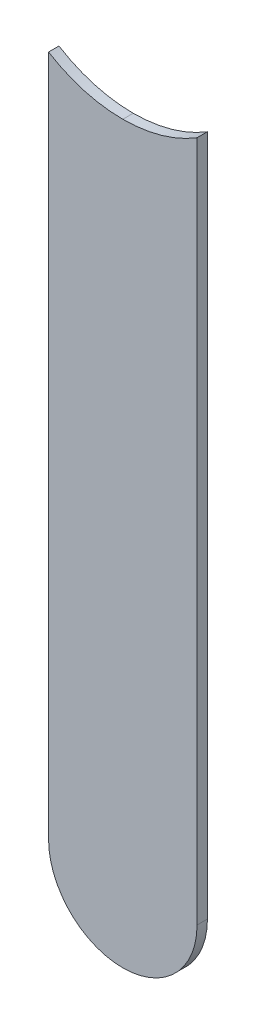
ISO-10303-21;
HEADER;
FILE_DESCRIPTION(('STEP AP214'),'2;1');
FILE_NAME('part.step','',(''),(''),'','','');
FILE_SCHEMA(('AUTOMOTIVE_DESIGN { 1 0 10303 214 1 1 1 1 }'));
ENDSEC;
DATA;
#1=APPLICATION_CONTEXT('core data for automotive mechanical design processes');
#2=APPLICATION_PROTOCOL_DEFINITION('international standard','automotive_design',2000,#1);
#3=PRODUCT_CONTEXT('',#1,'mechanical');
#4=PRODUCT('Part','Part','',(#3));
#5=PRODUCT_RELATED_PRODUCT_CATEGORY('part','',(#4));
#6=PRODUCT_DEFINITION_FORMATION('','',#4);
#7=PRODUCT_DEFINITION_CONTEXT('part definition',#1,'design');
#8=PRODUCT_DEFINITION('design','',#6,#7);
#9=PRODUCT_DEFINITION_SHAPE('','',#8);
#10=(LENGTH_UNIT() NAMED_UNIT(*) SI_UNIT(.MILLI.,.METRE.));
#11=(NAMED_UNIT(*) PLANE_ANGLE_UNIT() SI_UNIT($,.RADIAN.));
#12=(NAMED_UNIT(*) SI_UNIT($,.STERADIAN.) SOLID_ANGLE_UNIT());
#13=UNCERTAINTY_MEASURE_WITH_UNIT(LENGTH_MEASURE(1.E-05),#10,'distance_accuracy_value','');
#14=(GEOMETRIC_REPRESENTATION_CONTEXT(3) GLOBAL_UNCERTAINTY_ASSIGNED_CONTEXT((#13)) GLOBAL_UNIT_ASSIGNED_CONTEXT((#10,
#11,#12)) REPRESENTATION_CONTEXT('',''));
#15=CARTESIAN_POINT('',(0.,0.,0.));
#16=DIRECTION('',(0.,0.,1.));
#17=DIRECTION('',(1.,0.,0.));
#18=AXIS2_PLACEMENT_3D('',#15,#16,#17);
#19=CARTESIAN_POINT('',(154.87,-49.98,-0.045));
#20=DIRECTION('',(0.,0.,-1.));
#21=DIRECTION('',(0.,-1.,0.));
#22=AXIS2_PLACEMENT_3D('',#19,#20,#21);
#23=CYLINDRICAL_SURFACE('',#22,0.475);
#24=DIRECTION('',(0.,0.,1.));
#25=VECTOR('',#24,1.);
#26=CARTESIAN_POINT('',(154.87,-50.455,-0.045));
#27=LINE('',#26,#25);
#28=CARTESIAN_POINT('',(154.87,-50.455,1.6));
#29=VERTEX_POINT('',#28);
#30=CARTESIAN_POINT('',(154.87,-50.455,1.635));
#31=VERTEX_POINT('',#30);
#32=EDGE_CURVE('E66',#29,#31,#27,.T.);
#33=ORIENTED_EDGE('',*,*,#32,.F.);
#34=CARTESIAN_POINT('',(154.87,-49.98,1.6));
#35=DIRECTION('',(0.,0.,-1.));
#36=DIRECTION('',(0.,-1.,0.));
#37=AXIS2_PLACEMENT_3D('',#34,#35,#36);
#38=CIRCLE('',#37,0.475);
#39=CARTESIAN_POINT('',(154.62,-50.38388736053,1.6));
#40=VERTEX_POINT('',#39);
#41=EDGE_CURVE('E69',#29,#40,#38,.T.);
#42=ORIENTED_EDGE('',*,*,#41,.T.);
#43=DIRECTION('',(0.,0.,-1.));
#44=VECTOR('',#43,1.);
#45=CARTESIAN_POINT('',(154.62,-50.38388736053,-0.045));
#46=LINE('',#45,#44);
#47=CARTESIAN_POINT('',(154.62,-50.38388736053,1.635));
#48=VERTEX_POINT('',#47);
#49=EDGE_CURVE('E11',#48,#40,#46,.T.);
#50=ORIENTED_EDGE('',*,*,#49,.F.);
#51=CARTESIAN_POINT('',(154.87,-49.98,1.635));
#52=DIRECTION('',(0.,0.,-1.));
#53=DIRECTION('',(0.,-1.,0.));
#54=AXIS2_PLACEMENT_3D('',#51,#52,#53);
#55=CIRCLE('',#54,0.475);
#56=EDGE_CURVE('E72',#31,#48,#55,.T.);
#57=ORIENTED_EDGE('',*,*,#56,.F.);
#58=EDGE_LOOP('',(#33,#42,#50,#57));
#59=FACE_BOUND('',#58,.T.);
#60=ADVANCED_FACE('F17',(#59),#23,.F.);
#61=CARTESIAN_POINT('',(154.62,-49.98,1.6));
#62=DIRECTION('',(1.,0.,0.));
#63=DIRECTION('',(0.,1.,0.));
#64=AXIS2_PLACEMENT_3D('',#61,#62,#63);
#65=PLANE('',#64);
#66=DIRECTION('',(0.,0.,1.));
#67=VECTOR('',#66,1.);
#68=CARTESIAN_POINT('',(154.62,-52.68,1.6));
#69=LINE('',#68,#67);
#70=CARTESIAN_POINT('',(154.62,-52.68,1.6));
#71=VERTEX_POINT('',#70);
#72=CARTESIAN_POINT('',(154.62,-52.68,1.635));
#73=VERTEX_POINT('',#72);
#74=EDGE_CURVE('E20',#71,#73,#69,.T.);
#75=ORIENTED_EDGE('',*,*,#74,.T.);
#76=DIRECTION('',(0.,-1.,0.));
#77=VECTOR('',#76,1.);
#78=CARTESIAN_POINT('',(154.62,-49.98,1.635));
#79=LINE('',#78,#77);
#80=EDGE_CURVE('E105',#48,#73,#79,.T.);
#81=ORIENTED_EDGE('',*,*,#80,.F.);
#82=ORIENTED_EDGE('',*,*,#49,.T.);
#83=DIRECTION('',(0.,-1.,0.));
#84=VECTOR('',#83,1.);
#85=CARTESIAN_POINT('',(154.62,-49.98,1.6));
#86=LINE('',#85,#84);
#87=EDGE_CURVE('E94',#40,#71,#86,.T.);
#88=ORIENTED_EDGE('',*,*,#87,.T.);
#89=EDGE_LOOP('',(#75,#81,#82,#88));
#90=FACE_BOUND('',#89,.T.);
#91=ADVANCED_FACE('F193',(#90),#65,.F.);
#92=CARTESIAN_POINT('',(154.87,-52.68,1.6));
#93=DIRECTION('',(0.,0.,-1.));
#94=DIRECTION('',(-1.,0.,0.));
#95=AXIS2_PLACEMENT_3D('',#92,#93,#94);
#96=CYLINDRICAL_SURFACE('',#95,0.25);
#97=CARTESIAN_POINT('',(154.87,-52.68,1.6));
#98=DIRECTION('',(0.,0.,1.));
#99=DIRECTION('',(-1.,0.,0.));
#100=AXIS2_PLACEMENT_3D('',#97,#98,#99);
#101=CIRCLE('',#100,0.25);
#102=CARTESIAN_POINT('',(155.12,-52.68,1.6));
#103=VERTEX_POINT('',#102);
#104=EDGE_CURVE('E78',#71,#103,#101,.T.);
#105=ORIENTED_EDGE('',*,*,#104,.T.);
#106=DIRECTION('',(0.,0.,1.));
#107=VECTOR('',#106,1.);
#108=CARTESIAN_POINT('',(155.12,-52.68,1.6));
#109=LINE('',#108,#107);
#110=CARTESIAN_POINT('',(155.12,-52.68,1.635));
#111=VERTEX_POINT('',#110);
#112=EDGE_CURVE('E134',#103,#111,#109,.T.);
#113=ORIENTED_EDGE('',*,*,#112,.T.);
#114=CARTESIAN_POINT('',(154.87,-52.68,1.635));
#115=DIRECTION('',(0.,0.,1.));
#116=DIRECTION('',(-1.,0.,0.));
#117=AXIS2_PLACEMENT_3D('',#114,#115,#116);
#118=CIRCLE('',#117,0.25);
#119=EDGE_CURVE('E109',#73,#111,#118,.T.);
#120=ORIENTED_EDGE('',*,*,#119,.F.);
#121=ORIENTED_EDGE('',*,*,#74,.F.);
#122=EDGE_LOOP('',(#105,#113,#120,#121));
#123=FACE_BOUND('',#122,.T.);
#124=ADVANCED_FACE('F135',(#123),#96,.T.);
#125=CARTESIAN_POINT('',(155.12,-52.68,1.635));
#126=DIRECTION('',(0.,0.,1.));
#127=DIRECTION('',(1.,0.,0.));
#128=AXIS2_PLACEMENT_3D('',#125,#126,#127);
#129=PLANE('',#128);
#130=ORIENTED_EDGE('',*,*,#119,.T.);
#131=DIRECTION('',(0.,1.,0.));
#132=VECTOR('',#131,1.);
#133=CARTESIAN_POINT('',(155.12,-52.68,1.635));
#134=LINE('',#133,#132);
#135=CARTESIAN_POINT('',(155.12,-50.38388736053,1.635));
#136=VERTEX_POINT('',#135);
#137=EDGE_CURVE('E123',#111,#136,#134,.T.);
#138=ORIENTED_EDGE('',*,*,#137,.T.);
#139=CARTESIAN_POINT('',(154.87,-49.98,1.635));
#140=DIRECTION('',(0.,0.,-1.));
#141=DIRECTION('',(0.,-1.,0.));
#142=AXIS2_PLACEMENT_3D('',#139,#140,#141);
#143=CIRCLE('',#142,0.475);
#144=EDGE_CURVE('E77',#136,#31,#143,.T.);
#145=ORIENTED_EDGE('',*,*,#144,.T.);
#146=ORIENTED_EDGE('',*,*,#56,.T.);
#147=ORIENTED_EDGE('',*,*,#80,.T.);
#148=EDGE_LOOP('',(#130,#138,#145,#146,#147));
#149=FACE_BOUND('',#148,.T.);
#150=ADVANCED_FACE('F118',(#149),#129,.T.);
#151=CARTESIAN_POINT('',(154.87,-49.98,-0.045));
#152=DIRECTION('',(0.,0.,-1.));
#153=DIRECTION('',(0.,-1.,0.));
#154=AXIS2_PLACEMENT_3D('',#151,#152,#153);
#155=CYLINDRICAL_SURFACE('',#154,0.475);
#156=CARTESIAN_POINT('',(154.87,-49.98,1.6));
#157=DIRECTION('',(0.,0.,-1.));
#158=DIRECTION('',(0.,-1.,0.));
#159=AXIS2_PLACEMENT_3D('',#156,#157,#158);
#160=CIRCLE('',#159,0.475);
#161=CARTESIAN_POINT('',(155.12,-50.38388736053,1.6));
#162=VERTEX_POINT('',#161);
#163=EDGE_CURVE('E82',#162,#29,#160,.T.);
#164=ORIENTED_EDGE('',*,*,#163,.T.);
#165=ORIENTED_EDGE('',*,*,#32,.T.);
#166=ORIENTED_EDGE('',*,*,#144,.F.);
#167=DIRECTION('',(0.,0.,-1.));
#168=VECTOR('',#167,1.);
#169=CARTESIAN_POINT('',(155.12,-50.38388736053,-0.045));
#170=LINE('',#169,#168);
#171=EDGE_CURVE('E86',#136,#162,#170,.T.);
#172=ORIENTED_EDGE('',*,*,#171,.T.);
#173=EDGE_LOOP('',(#164,#165,#166,#172));
#174=FACE_BOUND('',#173,.T.);
#175=ADVANCED_FACE('F83',(#174),#155,.F.);
#176=CARTESIAN_POINT('',(155.12,-52.68,1.6));
#177=DIRECTION('',(0.,0.,1.));
#178=DIRECTION('',(1.,0.,0.));
#179=AXIS2_PLACEMENT_3D('',#176,#177,#178);
#180=PLANE('',#179);
#181=ORIENTED_EDGE('',*,*,#87,.F.);
#182=ORIENTED_EDGE('',*,*,#41,.F.);
#183=ORIENTED_EDGE('',*,*,#163,.F.);
#184=DIRECTION('',(0.,1.,0.));
#185=VECTOR('',#184,1.);
#186=CARTESIAN_POINT('',(155.12,-52.68,1.6));
#187=LINE('',#186,#185);
#188=EDGE_CURVE('E101',#103,#162,#187,.T.);
#189=ORIENTED_EDGE('',*,*,#188,.F.);
#190=ORIENTED_EDGE('',*,*,#104,.F.);
#191=EDGE_LOOP('',(#181,#182,#183,#189,#190));
#192=FACE_BOUND('',#191,.T.);
#193=ADVANCED_FACE('F92',(#192),#180,.F.);
#194=CARTESIAN_POINT('',(155.12,-52.68,1.6));
#195=DIRECTION('',(-1.,0.,0.));
#196=DIRECTION('',(0.,0.,1.));
#197=AXIS2_PLACEMENT_3D('',#194,#195,#196);
#198=PLANE('',#197);
#199=ORIENTED_EDGE('',*,*,#171,.F.);
#200=ORIENTED_EDGE('',*,*,#137,.F.);
#201=ORIENTED_EDGE('',*,*,#112,.F.);
#202=ORIENTED_EDGE('',*,*,#188,.T.);
#203=EDGE_LOOP('',(#199,#200,#201,#202));
#204=FACE_BOUND('',#203,.T.);
#205=ADVANCED_FACE('F138',(#204),#198,.F.);
#206=CLOSED_SHELL('',(#60,#91,#124,#150,#175,#193,#205));
#207=MANIFOLD_SOLID_BREP('B1',#206);
#208=ADVANCED_BREP_SHAPE_REPRESENTATION('',(#18,#207),#14);
#209=SHAPE_DEFINITION_REPRESENTATION(#9,#208);
ENDSEC;
END-ISO-10303-21;
